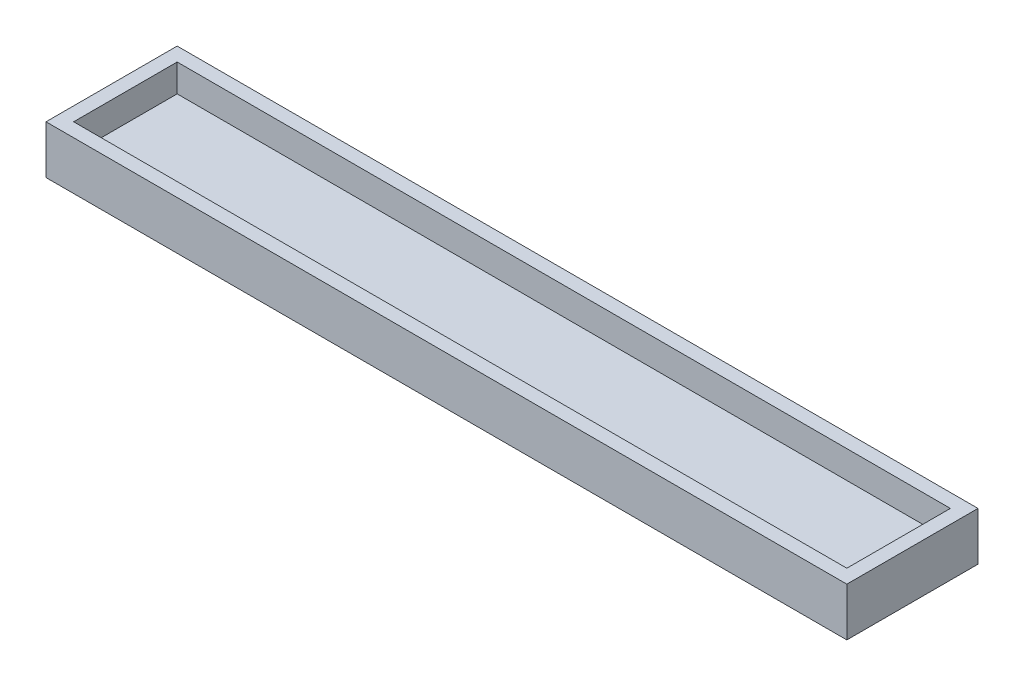
ISO-10303-21;
HEADER;
FILE_DESCRIPTION(('STEP AP214'),'2;1');
FILE_NAME('part.step','',(''),(''),'','','');
FILE_SCHEMA(('AUTOMOTIVE_DESIGN { 1 0 10303 214 1 1 1 1 }'));
ENDSEC;
DATA;
#1=APPLICATION_CONTEXT('core data for automotive mechanical design processes');
#2=APPLICATION_PROTOCOL_DEFINITION('international standard','automotive_design',2000,#1);
#3=PRODUCT_CONTEXT('',#1,'mechanical');
#4=PRODUCT('Part','Part','',(#3));
#5=PRODUCT_RELATED_PRODUCT_CATEGORY('part','',(#4));
#6=PRODUCT_DEFINITION_FORMATION('','',#4);
#7=PRODUCT_DEFINITION_CONTEXT('part definition',#1,'design');
#8=PRODUCT_DEFINITION('design','',#6,#7);
#9=PRODUCT_DEFINITION_SHAPE('','',#8);
#10=(LENGTH_UNIT() NAMED_UNIT(*) SI_UNIT(.MILLI.,.METRE.));
#11=(NAMED_UNIT(*) PLANE_ANGLE_UNIT() SI_UNIT($,.RADIAN.));
#12=(NAMED_UNIT(*) SI_UNIT($,.STERADIAN.) SOLID_ANGLE_UNIT());
#13=UNCERTAINTY_MEASURE_WITH_UNIT(LENGTH_MEASURE(1.E-05),#10,'distance_accuracy_value','');
#14=(GEOMETRIC_REPRESENTATION_CONTEXT(3) GLOBAL_UNCERTAINTY_ASSIGNED_CONTEXT((#13)) GLOBAL_UNIT_ASSIGNED_CONTEXT((#10,
#11,#12)) REPRESENTATION_CONTEXT('',''));
#15=CARTESIAN_POINT('',(0.,0.,0.));
#16=DIRECTION('',(0.,0.,1.));
#17=DIRECTION('',(1.,0.,0.));
#18=AXIS2_PLACEMENT_3D('',#15,#16,#17);
#19=CARTESIAN_POINT('',(0.,3.,0.));
#20=DIRECTION('',(0.,1.,0.));
#21=DIRECTION('',(0.,0.,1.));
#22=AXIS2_PLACEMENT_3D('',#19,#20,#21);
#23=PLANE('',#22);
#24=DIRECTION('',(1.,0.,0.));
#25=VECTOR('',#24,1.);
#26=CARTESIAN_POINT('',(0.,3.,0.));
#27=LINE('',#26,#25);
#28=CARTESIAN_POINT('',(0.,3.,0.));
#29=VERTEX_POINT('',#28);
#30=CARTESIAN_POINT('',(112.,3.,0.));
#31=VERTEX_POINT('',#30);
#32=EDGE_CURVE('E143',#29,#31,#27,.T.);
#33=ORIENTED_EDGE('',*,*,#32,.T.);
#34=DIRECTION('',(0.,0.,-1.));
#35=VECTOR('',#34,1.);
#36=CARTESIAN_POINT('',(112.,3.,0.));
#37=LINE('',#36,#35);
#38=CARTESIAN_POINT('',(112.,3.,-15.));
#39=VERTEX_POINT('',#38);
#40=EDGE_CURVE('E158',#31,#39,#37,.T.);
#41=ORIENTED_EDGE('',*,*,#40,.T.);
#42=DIRECTION('',(1.,0.,0.));
#43=VECTOR('',#42,1.);
#44=CARTESIAN_POINT('',(0.,3.,-15.));
#45=LINE('',#44,#43);
#46=CARTESIAN_POINT('',(0.,3.,-15.));
#47=VERTEX_POINT('',#46);
#48=EDGE_CURVE('E42',#47,#39,#45,.T.);
#49=ORIENTED_EDGE('',*,*,#48,.F.);
#50=DIRECTION('',(0.,0.,-1.));
#51=VECTOR('',#50,1.);
#52=CARTESIAN_POINT('',(0.,3.,0.));
#53=LINE('',#52,#51);
#54=EDGE_CURVE('E12',#29,#47,#53,.T.);
#55=ORIENTED_EDGE('',*,*,#54,.F.);
#56=EDGE_LOOP('',(#33,#41,#49,#55));
#57=FACE_BOUND('',#56,.T.);
#58=ADVANCED_FACE('F34',(#57),#23,.T.);
#59=CARTESIAN_POINT('',(112.,128.545735779738,0.));
#60=DIRECTION('',(-1.,0.,0.));
#61=DIRECTION('',(0.,0.,1.));
#62=AXIS2_PLACEMENT_3D('',#59,#60,#61);
#63=PLANE('',#62);
#64=DIRECTION('',(0.,-1.,0.));
#65=VECTOR('',#64,1.);
#66=CARTESIAN_POINT('',(112.,128.545735779738,-15.));
#67=LINE('',#66,#65);
#68=CARTESIAN_POINT('',(112.,7.00000000000001,-15.));
#69=VERTEX_POINT('',#68);
#70=EDGE_CURVE('E132',#69,#39,#67,.T.);
#71=ORIENTED_EDGE('',*,*,#70,.T.);
#72=ORIENTED_EDGE('',*,*,#40,.F.);
#73=DIRECTION('',(0.,-1.,0.));
#74=VECTOR('',#73,1.);
#75=CARTESIAN_POINT('',(112.,128.545735779738,0.));
#76=LINE('',#75,#74);
#77=CARTESIAN_POINT('',(112.,7.00000000000001,0.));
#78=VERTEX_POINT('',#77);
#79=EDGE_CURVE('E131',#78,#31,#76,.T.);
#80=ORIENTED_EDGE('',*,*,#79,.F.);
#81=DIRECTION('',(0.,0.,-1.));
#82=VECTOR('',#81,1.);
#83=CARTESIAN_POINT('',(112.,7.00000000000001,0.));
#84=LINE('',#83,#82);
#85=EDGE_CURVE('E133',#78,#69,#84,.T.);
#86=ORIENTED_EDGE('',*,*,#85,.T.);
#87=EDGE_LOOP('',(#71,#72,#80,#86));
#88=FACE_BOUND('',#87,.T.);
#89=ADVANCED_FACE('F164',(#88),#63,.T.);
#90=CARTESIAN_POINT('',(0.,128.545735779738,0.));
#91=DIRECTION('',(0.,0.,-1.));
#92=DIRECTION('',(-1.,0.,0.));
#93=AXIS2_PLACEMENT_3D('',#90,#91,#92);
#94=PLANE('',#93);
#95=ORIENTED_EDGE('',*,*,#79,.T.);
#96=ORIENTED_EDGE('',*,*,#32,.F.);
#97=DIRECTION('',(0.,-1.,0.));
#98=VECTOR('',#97,1.);
#99=CARTESIAN_POINT('',(0.,128.545735779738,0.));
#100=LINE('',#99,#98);
#101=CARTESIAN_POINT('',(0.,7.00000000000001,0.));
#102=VERTEX_POINT('',#101);
#103=EDGE_CURVE('E138',#102,#29,#100,.T.);
#104=ORIENTED_EDGE('',*,*,#103,.F.);
#105=DIRECTION('',(1.,0.,0.));
#106=VECTOR('',#105,1.);
#107=CARTESIAN_POINT('',(0.,7.00000000000001,0.));
#108=LINE('',#107,#106);
#109=EDGE_CURVE('E129',#102,#78,#108,.T.);
#110=ORIENTED_EDGE('',*,*,#109,.T.);
#111=EDGE_LOOP('',(#95,#96,#104,#110));
#112=FACE_BOUND('',#111,.T.);
#113=ADVANCED_FACE('F172',(#112),#94,.T.);
#114=CARTESIAN_POINT('',(0.,128.545735779738,0.));
#115=DIRECTION('',(-1.,0.,0.));
#116=DIRECTION('',(0.,0.,1.));
#117=AXIS2_PLACEMENT_3D('',#114,#115,#116);
#118=PLANE('',#117);
#119=ORIENTED_EDGE('',*,*,#54,.T.);
#120=DIRECTION('',(0.,-1.,0.));
#121=VECTOR('',#120,1.);
#122=CARTESIAN_POINT('',(0.,128.545735779738,-15.));
#123=LINE('',#122,#121);
#124=CARTESIAN_POINT('',(0.,7.00000000000001,-15.));
#125=VERTEX_POINT('',#124);
#126=EDGE_CURVE('E114',#125,#47,#123,.T.);
#127=ORIENTED_EDGE('',*,*,#126,.F.);
#128=DIRECTION('',(0.,0.,-1.));
#129=VECTOR('',#128,1.);
#130=CARTESIAN_POINT('',(0.,7.00000000000001,0.));
#131=LINE('',#130,#129);
#132=EDGE_CURVE('E104',#102,#125,#131,.T.);
#133=ORIENTED_EDGE('',*,*,#132,.F.);
#134=ORIENTED_EDGE('',*,*,#103,.T.);
#135=EDGE_LOOP('',(#119,#127,#133,#134));
#136=FACE_BOUND('',#135,.T.);
#137=ADVANCED_FACE('F170',(#136),#118,.F.);
#138=CARTESIAN_POINT('',(-2.,128.545735779738,0.));
#139=DIRECTION('',(-1.,0.,0.));
#140=DIRECTION('',(0.,0.,1.));
#141=AXIS2_PLACEMENT_3D('',#138,#139,#140);
#142=PLANE('',#141);
#143=DIRECTION('',(0.,-1.,0.));
#144=VECTOR('',#143,1.);
#145=CARTESIAN_POINT('',(-2.,128.545735779738,2.));
#146=LINE('',#145,#144);
#147=CARTESIAN_POINT('',(-2.,7.00000000000001,2.));
#148=VERTEX_POINT('',#147);
#149=CARTESIAN_POINT('',(-2.,0.,2.));
#150=VERTEX_POINT('',#149);
#151=EDGE_CURVE('E152',#148,#150,#146,.T.);
#152=ORIENTED_EDGE('',*,*,#151,.F.);
#153=DIRECTION('',(0.,0.,-1.));
#154=VECTOR('',#153,1.);
#155=CARTESIAN_POINT('',(-2.,7.00000000000001,0.));
#156=LINE('',#155,#154);
#157=CARTESIAN_POINT('',(-2.,7.00000000000001,-17.));
#158=VERTEX_POINT('',#157);
#159=EDGE_CURVE('E136',#148,#158,#156,.T.);
#160=ORIENTED_EDGE('',*,*,#159,.T.);
#161=DIRECTION('',(0.,-1.,0.));
#162=VECTOR('',#161,1.);
#163=CARTESIAN_POINT('',(-2.,128.545735779738,-17.));
#164=LINE('',#163,#162);
#165=CARTESIAN_POINT('',(-2.,0.,-17.));
#166=VERTEX_POINT('',#165);
#167=EDGE_CURVE('E118',#158,#166,#164,.T.);
#168=ORIENTED_EDGE('',*,*,#167,.T.);
#169=DIRECTION('',(0.,0.,-1.));
#170=VECTOR('',#169,1.);
#171=CARTESIAN_POINT('',(-2.,0.,0.));
#172=LINE('',#171,#170);
#173=EDGE_CURVE('E124',#150,#166,#172,.T.);
#174=ORIENTED_EDGE('',*,*,#173,.F.);
#175=EDGE_LOOP('',(#152,#160,#168,#174));
#176=FACE_BOUND('',#175,.T.);
#177=ADVANCED_FACE('F185',(#176),#142,.T.);
#178=CARTESIAN_POINT('',(0.,128.545735779738,2.));
#179=DIRECTION('',(0.,0.,-1.));
#180=DIRECTION('',(-1.,0.,0.));
#181=AXIS2_PLACEMENT_3D('',#178,#179,#180);
#182=PLANE('',#181);
#183=DIRECTION('',(1.,0.,0.));
#184=VECTOR('',#183,1.);
#185=CARTESIAN_POINT('',(0.,7.00000000000001,2.));
#186=LINE('',#185,#184);
#187=CARTESIAN_POINT('',(114.,7.00000000000001,2.));
#188=VERTEX_POINT('',#187);
#189=EDGE_CURVE('E101',#148,#188,#186,.T.);
#190=ORIENTED_EDGE('',*,*,#189,.F.);
#191=ORIENTED_EDGE('',*,*,#151,.T.);
#192=DIRECTION('',(1.,0.,0.));
#193=VECTOR('',#192,1.);
#194=CARTESIAN_POINT('',(0.,0.,2.));
#195=LINE('',#194,#193);
#196=CARTESIAN_POINT('',(114.,0.,2.));
#197=VERTEX_POINT('',#196);
#198=EDGE_CURVE('E154',#150,#197,#195,.T.);
#199=ORIENTED_EDGE('',*,*,#198,.T.);
#200=DIRECTION('',(0.,-1.,0.));
#201=VECTOR('',#200,1.);
#202=CARTESIAN_POINT('',(114.,128.545735779738,2.));
#203=LINE('',#202,#201);
#204=EDGE_CURVE('E120',#188,#197,#203,.T.);
#205=ORIENTED_EDGE('',*,*,#204,.F.);
#206=EDGE_LOOP('',(#190,#191,#199,#205));
#207=FACE_BOUND('',#206,.T.);
#208=ADVANCED_FACE('F190',(#207),#182,.F.);
#209=CARTESIAN_POINT('',(114.,128.545735779738,0.));
#210=DIRECTION('',(-1.,0.,0.));
#211=DIRECTION('',(0.,0.,1.));
#212=AXIS2_PLACEMENT_3D('',#209,#210,#211);
#213=PLANE('',#212);
#214=DIRECTION('',(0.,0.,-1.));
#215=VECTOR('',#214,1.);
#216=CARTESIAN_POINT('',(114.,7.00000000000001,0.));
#217=LINE('',#216,#215);
#218=CARTESIAN_POINT('',(114.,7.00000000000001,-17.));
#219=VERTEX_POINT('',#218);
#220=EDGE_CURVE('E93',#188,#219,#217,.T.);
#221=ORIENTED_EDGE('',*,*,#220,.F.);
#222=ORIENTED_EDGE('',*,*,#204,.T.);
#223=DIRECTION('',(0.,0.,-1.));
#224=VECTOR('',#223,1.);
#225=CARTESIAN_POINT('',(114.,0.,0.));
#226=LINE('',#225,#224);
#227=CARTESIAN_POINT('',(114.,0.,-17.));
#228=VERTEX_POINT('',#227);
#229=EDGE_CURVE('E110',#197,#228,#226,.T.);
#230=ORIENTED_EDGE('',*,*,#229,.T.);
#231=DIRECTION('',(0.,-1.,0.));
#232=VECTOR('',#231,1.);
#233=CARTESIAN_POINT('',(114.,128.545735779738,-17.));
#234=LINE('',#233,#232);
#235=EDGE_CURVE('E107',#219,#228,#234,.T.);
#236=ORIENTED_EDGE('',*,*,#235,.F.);
#237=EDGE_LOOP('',(#221,#222,#230,#236));
#238=FACE_BOUND('',#237,.T.);
#239=ADVANCED_FACE('F108',(#238),#213,.F.);
#240=CARTESIAN_POINT('',(0.,128.545735779738,-17.));
#241=DIRECTION('',(0.,0.,-1.));
#242=DIRECTION('',(-1.,0.,0.));
#243=AXIS2_PLACEMENT_3D('',#240,#241,#242);
#244=PLANE('',#243);
#245=ORIENTED_EDGE('',*,*,#167,.F.);
#246=DIRECTION('',(1.,0.,0.));
#247=VECTOR('',#246,1.);
#248=CARTESIAN_POINT('',(0.,7.00000000000001,-17.));
#249=LINE('',#248,#247);
#250=EDGE_CURVE('E98',#158,#219,#249,.T.);
#251=ORIENTED_EDGE('',*,*,#250,.T.);
#252=ORIENTED_EDGE('',*,*,#235,.T.);
#253=DIRECTION('',(1.,0.,0.));
#254=VECTOR('',#253,1.);
#255=CARTESIAN_POINT('',(0.,0.,-17.));
#256=LINE('',#255,#254);
#257=EDGE_CURVE('E139',#166,#228,#256,.T.);
#258=ORIENTED_EDGE('',*,*,#257,.F.);
#259=EDGE_LOOP('',(#245,#251,#252,#258));
#260=FACE_BOUND('',#259,.T.);
#261=ADVANCED_FACE('F117',(#260),#244,.T.);
#262=CARTESIAN_POINT('',(0.,128.545735779738,-15.));
#263=DIRECTION('',(0.,0.,-1.));
#264=DIRECTION('',(-1.,0.,0.));
#265=AXIS2_PLACEMENT_3D('',#262,#263,#264);
#266=PLANE('',#265);
#267=ORIENTED_EDGE('',*,*,#48,.T.);
#268=ORIENTED_EDGE('',*,*,#70,.F.);
#269=DIRECTION('',(1.,0.,0.));
#270=VECTOR('',#269,1.);
#271=CARTESIAN_POINT('',(0.,7.00000000000001,-15.));
#272=LINE('',#271,#270);
#273=EDGE_CURVE('E128',#125,#69,#272,.T.);
#274=ORIENTED_EDGE('',*,*,#273,.F.);
#275=ORIENTED_EDGE('',*,*,#126,.T.);
#276=EDGE_LOOP('',(#267,#268,#274,#275));
#277=FACE_BOUND('',#276,.T.);
#278=ADVANCED_FACE('F160',(#277),#266,.F.);
#279=CARTESIAN_POINT('',(0.,7.,0.));
#280=DIRECTION('',(0.,1.,0.));
#281=DIRECTION('',(0.,0.,1.));
#282=AXIS2_PLACEMENT_3D('',#279,#280,#281);
#283=PLANE('',#282);
#284=ORIENTED_EDGE('',*,*,#159,.F.);
#285=ORIENTED_EDGE('',*,*,#189,.T.);
#286=ORIENTED_EDGE('',*,*,#220,.T.);
#287=ORIENTED_EDGE('',*,*,#250,.F.);
#288=EDGE_LOOP('',(#284,#285,#286,#287));
#289=FACE_BOUND('',#288,.T.);
#290=ORIENTED_EDGE('',*,*,#85,.F.);
#291=ORIENTED_EDGE('',*,*,#109,.F.);
#292=ORIENTED_EDGE('',*,*,#132,.T.);
#293=ORIENTED_EDGE('',*,*,#273,.T.);
#294=EDGE_LOOP('',(#290,#291,#292,#293));
#295=FACE_BOUND('',#294,.T.);
#296=ADVANCED_FACE('F95',(#289,#295),#283,.T.);
#297=CARTESIAN_POINT('',(0.,0.,0.));
#298=DIRECTION('',(0.,1.,0.));
#299=DIRECTION('',(0.,0.,1.));
#300=AXIS2_PLACEMENT_3D('',#297,#298,#299);
#301=PLANE('',#300);
#302=ORIENTED_EDGE('',*,*,#173,.T.);
#303=ORIENTED_EDGE('',*,*,#257,.T.);
#304=ORIENTED_EDGE('',*,*,#229,.F.);
#305=ORIENTED_EDGE('',*,*,#198,.F.);
#306=EDGE_LOOP('',(#302,#303,#304,#305));
#307=FACE_BOUND('',#306,.T.);
#308=ADVANCED_FACE('F36',(#307),#301,.F.);
#309=CLOSED_SHELL('',(#58,#89,#113,#137,#177,#208,#239,#261,#278,#296,#308));
#310=MANIFOLD_SOLID_BREP('B2',#309);
#311=ADVANCED_BREP_SHAPE_REPRESENTATION('',(#18,#310),#14);
#312=SHAPE_DEFINITION_REPRESENTATION(#9,#311);
ENDSEC;
END-ISO-10303-21;
